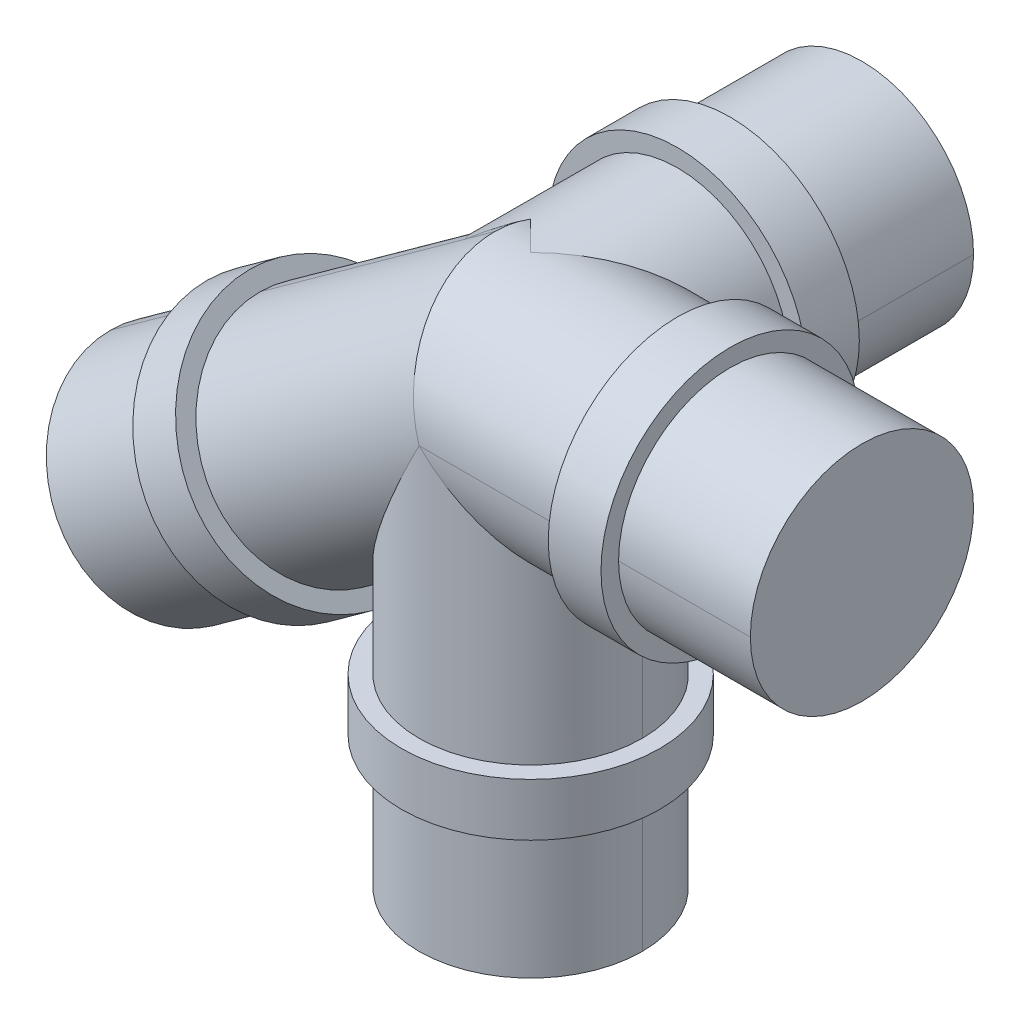
ISO-10303-21;
HEADER;
FILE_DESCRIPTION(('STEP AP214'),'2;1');
FILE_NAME('part.step','',(''),(''),'','','');
FILE_SCHEMA(('AUTOMOTIVE_DESIGN { 1 0 10303 214 1 1 1 1 }'));
ENDSEC;
DATA;
#1=APPLICATION_CONTEXT('core data for automotive mechanical design processes');
#2=APPLICATION_PROTOCOL_DEFINITION('international standard','automotive_design',2000,#1);
#3=PRODUCT_CONTEXT('',#1,'mechanical');
#4=PRODUCT('Part','Part','',(#3));
#5=PRODUCT_RELATED_PRODUCT_CATEGORY('part','',(#4));
#6=PRODUCT_DEFINITION_FORMATION('','',#4);
#7=PRODUCT_DEFINITION_CONTEXT('part definition',#1,'design');
#8=PRODUCT_DEFINITION('design','',#6,#7);
#9=PRODUCT_DEFINITION_SHAPE('','',#8);
#10=(LENGTH_UNIT() NAMED_UNIT(*) SI_UNIT(.MILLI.,.METRE.));
#11=(NAMED_UNIT(*) PLANE_ANGLE_UNIT() SI_UNIT($,.RADIAN.));
#12=(NAMED_UNIT(*) SI_UNIT($,.STERADIAN.) SOLID_ANGLE_UNIT());
#13=UNCERTAINTY_MEASURE_WITH_UNIT(LENGTH_MEASURE(1.E-05),#10,'distance_accuracy_value','');
#14=(GEOMETRIC_REPRESENTATION_CONTEXT(3) GLOBAL_UNCERTAINTY_ASSIGNED_CONTEXT((#13)) GLOBAL_UNIT_ASSIGNED_CONTEXT((#10,
#11,#12)) REPRESENTATION_CONTEXT('',''));
#15=CARTESIAN_POINT('',(0.,0.,0.));
#16=DIRECTION('',(0.,0.,1.));
#17=DIRECTION('',(1.,0.,0.));
#18=AXIS2_PLACEMENT_3D('',#15,#16,#17);
#19=CARTESIAN_POINT('',(699.112393095024,3041.53288183794,4064.45483546757));
#20=DIRECTION('',(0.,-1.,0.));
#21=DIRECTION('',(1.,0.,0.));
#22=AXIS2_PLACEMENT_3D('',#19,#20,#21);
#23=CYLINDRICAL_SURFACE('',#22,12.7);
#24=DIRECTION('',(0.,-1.,0.));
#25=VECTOR('',#24,1.);
#26=CARTESIAN_POINT('',(686.412393095024,3041.53288183794,4064.45483546757));
#27=LINE('',#26,#25);
#28=CARTESIAN_POINT('',(686.412393095024,3016.69478394616,4064.45483546757));
#29=VERTEX_POINT('',#28);
#30=CARTESIAN_POINT('',(686.412393095024,3012.69478394616,4064.45483546757));
#31=VERTEX_POINT('',#30);
#32=EDGE_CURVE('E176',#29,#31,#27,.T.);
#33=ORIENTED_EDGE('',*,*,#32,.T.);
#34=CARTESIAN_POINT('',(699.112393095024,3012.69478394616,4064.45483546757));
#35=DIRECTION('',(0.,-1.,0.));
#36=DIRECTION('',(0.,0.,-1.));
#37=AXIS2_PLACEMENT_3D('',#34,#35,#36);
#38=CIRCLE('',#37,12.6999999999993);
#39=CARTESIAN_POINT('',(711.812393095023,3012.69478394616,4064.45483546757));
#40=VERTEX_POINT('',#39);
#41=EDGE_CURVE('E60',#40,#31,#38,.T.);
#42=ORIENTED_EDGE('',*,*,#41,.F.);
#43=DIRECTION('',(0.,-1.,0.));
#44=VECTOR('',#43,1.);
#45=CARTESIAN_POINT('',(711.812393095024,3041.53288183794,4064.45483546757));
#46=LINE('',#45,#44);
#47=CARTESIAN_POINT('',(711.812393095024,3028.83288183794,4064.45483546757));
#48=VERTEX_POINT('',#47);
#49=EDGE_CURVE('E215',#48,#40,#46,.T.);
#50=ORIENTED_EDGE('',*,*,#49,.F.);
#51=CARTESIAN_POINT('',(699.112393095024,3041.53288183794,4077.15483546757));
#52=CARTESIAN_POINT('',(706.551880852886,3034.09339408007,4077.15483546757));
#53=CARTESIAN_POINT('',(711.812393095024,3028.83288183794,4071.89432322543));
#54=CARTESIAN_POINT('',(711.812393095024,3028.83288183794,4064.45483546757));
#55=(BOUNDED_CURVE() B_SPLINE_CURVE(3,(#51,#52,#53,#54),.UNSPECIFIED.,.F.,
.F.) B_SPLINE_CURVE_WITH_KNOTS((4,4),(4.7123889803847,6.28318530717958),
.UNSPECIFIED.) CURVE() GEOMETRIC_REPRESENTATION_ITEM() RATIONAL_B_SPLINE_CURVE((1.,
0.804737854124367,0.804737854124367,1.)) REPRESENTATION_ITEM(''));
#56=CARTESIAN_POINT('',(699.112393095024,3041.53288183794,4077.15483546757));
#57=VERTEX_POINT('',#56);
#58=EDGE_CURVE('E271',#57,#48,#55,.T.);
#59=ORIENTED_EDGE('',*,*,#58,.F.);
#60=CARTESIAN_POINT('',(686.412393095024,3016.69478394616,4064.45483546757));
#61=CARTESIAN_POINT('',(686.412393095024,3016.69478394616,4071.89432322543));
#62=CARTESIAN_POINT('',(691.672905337162,3026.98306095649,4077.15483546757));
#63=CARTESIAN_POINT('',(699.112393095024,3041.53288183794,4077.15483546757));
#64=(BOUNDED_CURVE() B_SPLINE_CURVE(3,(#60,#61,#62,#63),.UNSPECIFIED.,.F.,
.F.) B_SPLINE_CURVE_WITH_KNOTS((4,4),(3.14159265358979,4.71238898038468),
.UNSPECIFIED.) CURVE() GEOMETRIC_REPRESENTATION_ITEM() RATIONAL_B_SPLINE_CURVE((1.,
0.804737854124366,0.804737854124366,1.)) REPRESENTATION_ITEM(''));
#65=EDGE_CURVE('E224',#29,#57,#64,.T.);
#66=ORIENTED_EDGE('',*,*,#65,.F.);
#67=EDGE_LOOP('',(#33,#42,#50,#59,#66));
#68=FACE_BOUND('',#67,.T.);
#69=ADVANCED_FACE('F39',(#68),#23,.T.);
#70=CARTESIAN_POINT('',(699.112393095024,3041.53288183794,4064.45483546757));
#71=DIRECTION('',(0.,-1.,0.));
#72=DIRECTION('',(1.,0.,0.));
#73=AXIS2_PLACEMENT_3D('',#70,#71,#72);
#74=CYLINDRICAL_SURFACE('',#73,12.7);
#75=ORIENTED_EDGE('',*,*,#49,.T.);
#76=CARTESIAN_POINT('',(699.112393095024,3012.69478394616,4064.45483546757));
#77=DIRECTION('',(0.,-1.,0.));
#78=DIRECTION('',(0.,0.,-1.));
#79=AXIS2_PLACEMENT_3D('',#76,#77,#78);
#80=CIRCLE('',#79,12.7);
#81=EDGE_CURVE('E11',#40,#31,#80,.F.);
#82=ORIENTED_EDGE('',*,*,#81,.T.);
#83=ORIENTED_EDGE('',*,*,#32,.F.);
#84=CARTESIAN_POINT('',(693.330687958543,3030.22527883311,4053.14723246274));
#85=CARTESIAN_POINT('',(688.969024045552,3021.69492960147,4055.37740048673));
#86=CARTESIAN_POINT('',(686.412393095024,3016.69478394616,4059.55608445276));
#87=CARTESIAN_POINT('',(686.412393095024,3016.69478394616,4064.45483546757));
#88=(BOUNDED_CURVE() B_SPLINE_CURVE(3,(#84,#85,#86,#87),.UNSPECIFIED.,.F.,
.F.) B_SPLINE_CURVE_WITH_KNOTS((4,4),(2.04345197007274,3.14159265358979),
.UNSPECIFIED.) CURVE() GEOMETRIC_REPRESENTATION_ITEM() RATIONAL_B_SPLINE_CURVE((1.,
0.902006716050874,0.902006716050874,1.)) REPRESENTATION_ITEM(''));
#89=CARTESIAN_POINT('',(693.330687958543,3030.22527883311,4053.14723246274));
#90=VERTEX_POINT('',#89);
#91=EDGE_CURVE('E219',#90,#29,#88,.T.);
#92=ORIENTED_EDGE('',*,*,#91,.F.);
#93=CARTESIAN_POINT('',(708.092649216093,3032.55262571687,4055.4745793465));
#94=CARTESIAN_POINT('',(704.055047548784,3028.51502404956,4051.43697767919));
#95=CARTESIAN_POINT('',(698.414685133015,3027.62577365372,4050.54772728335));
#96=CARTESIAN_POINT('',(693.330687958543,3030.22527883311,4053.14723246274));
#97=(BOUNDED_CURVE() B_SPLINE_CURVE(3,(#93,#94,#95,#96),.UNSPECIFIED.,.F.,
.F.) B_SPLINE_CURVE_WITH_KNOTS((4,4),(2.35619449019236,3.61424829686762),
.UNSPECIFIED.) CURVE() GEOMETRIC_REPRESENTATION_ITEM() RATIONAL_B_SPLINE_CURVE((1.,
0.872400280301182,0.872400280301182,1.)) REPRESENTATION_ITEM(''));
#98=CARTESIAN_POINT('',(708.092649216093,3032.55262571687,4055.4745793465));
#99=VERTEX_POINT('',#98);
#100=EDGE_CURVE('E270',#99,#90,#97,.T.);
#101=ORIENTED_EDGE('',*,*,#100,.F.);
#102=CARTESIAN_POINT('',(711.812393095024,3028.83288183794,4064.45483546757));
#103=CARTESIAN_POINT('',(711.812393095024,3028.83288183794,4061.04156947135));
#104=CARTESIAN_POINT('',(710.506192748015,3030.13908218495,4057.88812287842));
#105=CARTESIAN_POINT('',(708.092649216093,3032.55262571687,4055.4745793465));
#106=(BOUNDED_CURVE() B_SPLINE_CURVE(3,(#102,#103,#104,#105),.UNSPECIFIED.,.F.,
.F.) B_SPLINE_CURVE_WITH_KNOTS((4,4),(0.,0.785398163397456),
.UNSPECIFIED.) CURVE() GEOMETRIC_REPRESENTATION_ITEM() RATIONAL_B_SPLINE_CURVE((1.,
0.949253021674189,0.949253021674189,1.)) REPRESENTATION_ITEM(''));
#107=EDGE_CURVE('E318',#48,#99,#106,.T.);
#108=ORIENTED_EDGE('',*,*,#107,.F.);
#109=EDGE_LOOP('',(#75,#82,#83,#92,#101,#108));
#110=FACE_BOUND('',#109,.T.);
#111=ADVANCED_FACE('F428',(#110),#74,.T.);
#112=CARTESIAN_POINT('',(87.4499312465951,2599.77665939185,4064.45483546757));
#113=DIRECTION('',(0.81067922839988,0.585490553844359,0.));
#114=DIRECTION('',(-0.585490553844359,0.81067922839988,0.));
#115=AXIS2_PLACEMENT_3D('',#112,#113,#114);
#116=CYLINDRICAL_SURFACE('',#115,12.7);
#117=DIRECTION('',(0.810679228399881,0.585490553844358,0.));
#118=VECTOR('',#117,1.);
#119=CARTESIAN_POINT('',(80.0142012127719,2610.07228559253,4064.45483546757));
#120=LINE('',#119,#118);
#121=CARTESIAN_POINT('',(668.298216113776,3034.94407413214,4064.45483546757));
#122=VERTEX_POINT('',#121);
#123=CARTESIAN_POINT('',(691.676663061201,3051.82850803862,4064.45483546757));
#124=VERTEX_POINT('',#123);
#125=EDGE_CURVE('E223',#122,#124,#120,.T.);
#126=ORIENTED_EDGE('',*,*,#125,.F.);
#127=CARTESIAN_POINT('',(675.7339461476,3024.64844793146,4064.45483546757));
#128=DIRECTION('',(-0.810679228399883,-0.585490553844356,0.));
#129=DIRECTION('',(0.585490553844356,-0.810679228399883,0.));
#130=AXIS2_PLACEMENT_3D('',#127,#128,#129);
#131=CIRCLE('',#130,12.6999999999995);
#132=CARTESIAN_POINT('',(683.169676181423,3014.35282173078,4064.45483546757));
#133=VERTEX_POINT('',#132);
#134=EDGE_CURVE('E398',#133,#122,#131,.T.);
#135=ORIENTED_EDGE('',*,*,#134,.F.);
#136=DIRECTION('',(0.810679228399881,0.585490553844358,0.));
#137=VECTOR('',#136,1.);
#138=CARTESIAN_POINT('',(94.885661280418,2589.48103319117,4064.45483546757));
#139=LINE('',#138,#137);
#140=EDGE_CURVE('E230',#133,#29,#139,.T.);
#141=ORIENTED_EDGE('',*,*,#140,.T.);
#142=ORIENTED_EDGE('',*,*,#65,.T.);
#143=CARTESIAN_POINT('',(699.112393095024,3041.53288183794,4077.15483546757));
#144=CARTESIAN_POINT('',(696.706804220225,3048.9723695958,4077.15483546757));
#145=CARTESIAN_POINT('',(695.005796014107,3054.23288183794,4071.89432322543));
#146=CARTESIAN_POINT('',(695.005796014108,3054.23288183794,4064.45483546757));
#147=(BOUNDED_CURVE() B_SPLINE_CURVE(3,(#143,#144,#145,#146),.UNSPECIFIED.,.F.,
.F.) B_SPLINE_CURVE_WITH_KNOTS((4,4),(4.71238898038467,6.28318530717959),
.UNSPECIFIED.) CURVE() GEOMETRIC_REPRESENTATION_ITEM() RATIONAL_B_SPLINE_CURVE((1.,
0.804737854124361,0.804737854124361,1.)) REPRESENTATION_ITEM(''));
#148=CARTESIAN_POINT('',(695.005796014108,3054.23288183794,4064.45483546757));
#149=VERTEX_POINT('',#148);
#150=EDGE_CURVE('E231',#57,#149,#147,.T.);
#151=ORIENTED_EDGE('',*,*,#150,.T.);
#152=DIRECTION('',(0.810679228399881,0.585490553844358,0.));
#153=VECTOR('',#152,1.);
#154=CARTESIAN_POINT('',(80.0142012127719,2610.07228559253,4064.45483546757));
#155=LINE('',#154,#153);
#156=EDGE_CURVE('E257',#124,#149,#155,.T.);
#157=ORIENTED_EDGE('',*,*,#156,.F.);
#158=EDGE_LOOP('',(#126,#135,#141,#142,#151,#157));
#159=FACE_BOUND('',#158,.T.);
#160=ADVANCED_FACE('F435',(#159),#116,.T.);
#161=CARTESIAN_POINT('',(87.4499312465951,2599.77665939185,4064.45483546757));
#162=DIRECTION('',(0.81067922839988,0.585490553844359,0.));
#163=DIRECTION('',(-0.585490553844359,0.81067922839988,0.));
#164=AXIS2_PLACEMENT_3D('',#161,#162,#163);
#165=CYLINDRICAL_SURFACE('',#164,12.7);
#166=ORIENTED_EDGE('',*,*,#140,.F.);
#167=CARTESIAN_POINT('',(675.733946147598,3024.64844793146,4064.45483546757));
#168=DIRECTION('',(-0.810679228399883,-0.585490553844356,0.));
#169=DIRECTION('',(0.585490553844356,-0.810679228399883,0.));
#170=AXIS2_PLACEMENT_3D('',#167,#168,#169);
#171=CIRCLE('',#170,12.7);
#172=EDGE_CURVE('E187',#133,#122,#171,.F.);
#173=ORIENTED_EDGE('',*,*,#172,.T.);
#174=ORIENTED_EDGE('',*,*,#125,.T.);
#175=CARTESIAN_POINT('',(686.412393095024,3041.53288183794,4054.15920926689));
#176=CARTESIAN_POINT('',(686.412393095024,3045.69129763272,4056.59392243369));
#177=CARTESIAN_POINT('',(688.305521753318,3049.39379487181,4060.29641967278));
#178=CARTESIAN_POINT('',(691.676663061201,3051.82850803862,4064.45483546757));
#179=(BOUNDED_CURVE() B_SPLINE_CURVE(3,(#175,#176,#177,#178),.UNSPECIFIED.,.F.,
.F.) B_SPLINE_CURVE_WITH_KNOTS((4,4),(3.76707769382902,4.7123889803847),
.UNSPECIFIED.) CURVE() GEOMETRIC_REPRESENTATION_ITEM() RATIONAL_B_SPLINE_CURVE((1.,
0.926908294216652,0.926908294216652,1.)) REPRESENTATION_ITEM(''));
#180=CARTESIAN_POINT('',(686.412393095024,3041.53288183794,4054.15920926689));
#181=VERTEX_POINT('',#180);
#182=EDGE_CURVE('E240',#181,#124,#179,.T.);
#183=ORIENTED_EDGE('',*,*,#182,.F.);
#184=CARTESIAN_POINT('',(693.330687958543,3030.22527883311,4053.14723246274));
#185=CARTESIAN_POINT('',(688.969024045551,3032.4554468571,4050.91706443875));
#186=CARTESIAN_POINT('',(686.412393095024,3036.63413082313,4051.29103682208));
#187=CARTESIAN_POINT('',(686.412393095024,3041.53288183794,4054.15920926689));
#188=(BOUNDED_CURVE() B_SPLINE_CURVE(3,(#184,#185,#186,#187),.UNSPECIFIED.,.F.,
.F.) B_SPLINE_CURVE_WITH_KNOTS((4,4),(2.66893701031195,3.76707769382902),
.UNSPECIFIED.) CURVE() GEOMETRIC_REPRESENTATION_ITEM() RATIONAL_B_SPLINE_CURVE((1.,
0.902006716050869,0.902006716050869,1.)) REPRESENTATION_ITEM(''));
#189=EDGE_CURVE('E264',#90,#181,#188,.T.);
#190=ORIENTED_EDGE('',*,*,#189,.F.);
#191=ORIENTED_EDGE('',*,*,#91,.T.);
#192=EDGE_LOOP('',(#166,#173,#174,#183,#190,#191));
#193=FACE_BOUND('',#192,.T.);
#194=ADVANCED_FACE('F489',(#193),#165,.T.);
#195=CARTESIAN_POINT('',(699.112393095024,3041.53288183794,3664.45483546757));
#196=DIRECTION('',(0.,0.,1.));
#197=DIRECTION('',(1.,0.,0.));
#198=AXIS2_PLACEMENT_3D('',#195,#196,#197);
#199=CYLINDRICAL_SURFACE('',#198,12.7);
#200=DIRECTION('',(0.,0.,1.));
#201=VECTOR('',#200,1.);
#202=CARTESIAN_POINT('',(711.812393095024,3041.53288183794,3664.45483546757));
#203=LINE('',#202,#201);
#204=CARTESIAN_POINT('',(711.812393095024,3041.53288183794,4047.75483546757));
#205=VERTEX_POINT('',#204);
#206=CARTESIAN_POINT('',(711.812393095024,3041.53288183794,4051.75483546757));
#207=VERTEX_POINT('',#206);
#208=EDGE_CURVE('E278',#205,#207,#203,.T.);
#209=ORIENTED_EDGE('',*,*,#208,.F.);
#210=CARTESIAN_POINT('',(699.112393095024,3041.53288183794,4047.75483546757));
#211=DIRECTION('',(0.,0.,-1.));
#212=DIRECTION('',(-1.,0.,0.));
#213=AXIS2_PLACEMENT_3D('',#210,#211,#212);
#214=CIRCLE('',#213,12.6999999999996);
#215=CARTESIAN_POINT('',(686.412393095024,3041.53288183794,4047.75483546757));
#216=VERTEX_POINT('',#215);
#217=EDGE_CURVE('E387',#216,#205,#214,.T.);
#218=ORIENTED_EDGE('',*,*,#217,.F.);
#219=DIRECTION('',(0.,0.,1.));
#220=VECTOR('',#219,1.);
#221=CARTESIAN_POINT('',(686.412393095024,3041.53288183794,3664.45483546757));
#222=LINE('',#221,#220);
#223=EDGE_CURVE('E251',#216,#181,#222,.T.);
#224=ORIENTED_EDGE('',*,*,#223,.T.);
#225=ORIENTED_EDGE('',*,*,#182,.T.);
#226=CARTESIAN_POINT('',(691.676663061201,3051.82850803862,4064.45483546757));
#227=CARTESIAN_POINT('',(692.75435374724,3052.60684020075,4063.12546788507));
#228=CARTESIAN_POINT('',(693.940108812374,3053.2078419436,4061.81232004051));
#229=CARTESIAN_POINT('',(695.204993240173,3053.61684751044,4060.54743561272));
#230=(BOUNDED_CURVE() B_SPLINE_CURVE(3,(#226,#227,#228,#229),.UNSPECIFIED.,.F.,
.F.) B_SPLINE_CURVE_WITH_KNOTS((4,4),(4.71238898038469,5.02513150050431),
.UNSPECIFIED.) CURVE() GEOMETRIC_REPRESENTATION_ITEM() RATIONAL_B_SPLINE_CURVE((1.,
0.9918659377805,0.9918659377805,1.)) REPRESENTATION_ITEM(''));
#231=CARTESIAN_POINT('',(695.204993240173,3053.61684751044,4060.54743561272));
#232=VERTEX_POINT('',#231);
#233=EDGE_CURVE('E232',#124,#232,#230,.T.);
#234=ORIENTED_EDGE('',*,*,#233,.T.);
#235=CARTESIAN_POINT('',(695.204993240173,3053.61684751044,4060.54743561272));
#236=CARTESIAN_POINT('',(696.469877667972,3054.02585307729,4061.81232004051));
#237=CARTESIAN_POINT('',(697.783025512526,3054.23288183794,4063.12546788507));
#238=CARTESIAN_POINT('',(699.112393095024,3054.23288183794,4064.45483546757));
#239=(BOUNDED_CURVE() B_SPLINE_CURVE(3,(#235,#236,#237,#238),.UNSPECIFIED.,.F.,
.F.) B_SPLINE_CURVE_WITH_KNOTS((4,4),(4.39964646026506,4.71238898038469),
.UNSPECIFIED.) CURVE() GEOMETRIC_REPRESENTATION_ITEM() RATIONAL_B_SPLINE_CURVE((1.,
0.991865937780499,0.991865937780499,1.)) REPRESENTATION_ITEM(''));
#240=CARTESIAN_POINT('',(699.112393095024,3054.23288183794,4064.45483546757));
#241=VERTEX_POINT('',#240);
#242=EDGE_CURVE('E241',#232,#241,#239,.T.);
#243=ORIENTED_EDGE('',*,*,#242,.T.);
#244=CARTESIAN_POINT('',(699.112393095024,3054.23288183794,4064.45483546757));
#245=CARTESIAN_POINT('',(706.551880852886,3054.23288183794,4057.01534770971));
#246=CARTESIAN_POINT('',(711.812393095024,3048.9723695958,4051.75483546757));
#247=CARTESIAN_POINT('',(711.812393095024,3041.53288183794,4051.75483546757));
#248=(BOUNDED_CURVE() B_SPLINE_CURVE(3,(#244,#245,#246,#247),.UNSPECIFIED.,.F.,
.F.) B_SPLINE_CURVE_WITH_KNOTS((4,4),(4.71238898038469,6.28318530717959),
.UNSPECIFIED.) CURVE() GEOMETRIC_REPRESENTATION_ITEM() RATIONAL_B_SPLINE_CURVE((1.,
0.804737854124364,0.804737854124364,1.)) REPRESENTATION_ITEM(''));
#249=EDGE_CURVE('E277',#241,#207,#248,.T.);
#250=ORIENTED_EDGE('',*,*,#249,.T.);
#251=EDGE_LOOP('',(#209,#218,#224,#225,#234,#243,#250));
#252=FACE_BOUND('',#251,.T.);
#253=ADVANCED_FACE('F455',(#252),#199,.T.);
#254=CARTESIAN_POINT('',(699.112393095024,3041.53288183794,3664.45483546757));
#255=DIRECTION('',(0.,0.,1.));
#256=DIRECTION('',(1.,0.,0.));
#257=AXIS2_PLACEMENT_3D('',#254,#255,#256);
#258=CYLINDRICAL_SURFACE('',#257,12.7);
#259=ORIENTED_EDGE('',*,*,#223,.F.);
#260=CARTESIAN_POINT('',(699.112393095024,3041.53288183794,4047.75483546757));
#261=DIRECTION('',(0.,0.,-1.));
#262=DIRECTION('',(-1.,0.,0.));
#263=AXIS2_PLACEMENT_3D('',#260,#261,#262);
#264=CIRCLE('',#263,12.7);
#265=EDGE_CURVE('E194',#216,#205,#264,.F.);
#266=ORIENTED_EDGE('',*,*,#265,.T.);
#267=ORIENTED_EDGE('',*,*,#208,.T.);
#268=CARTESIAN_POINT('',(711.812393095024,3041.53288183794,4051.75483546757));
#269=CARTESIAN_POINT('',(711.812393095024,3038.11961584172,4051.75483546757));
#270=CARTESIAN_POINT('',(710.506192748015,3034.96616924879,4053.06103581458));
#271=CARTESIAN_POINT('',(708.092649216093,3032.55262571687,4055.4745793465));
#272=(BOUNDED_CURVE() B_SPLINE_CURVE(3,(#268,#269,#270,#271),.UNSPECIFIED.,.F.,
.F.) B_SPLINE_CURVE_WITH_KNOTS((4,4),(0.,0.785398163397458),
.UNSPECIFIED.) CURVE() GEOMETRIC_REPRESENTATION_ITEM() RATIONAL_B_SPLINE_CURVE((1.,
0.94925302167419,0.94925302167419,1.)) REPRESENTATION_ITEM(''));
#273=EDGE_CURVE('E309',#207,#99,#272,.T.);
#274=ORIENTED_EDGE('',*,*,#273,.T.);
#275=ORIENTED_EDGE('',*,*,#100,.T.);
#276=ORIENTED_EDGE('',*,*,#189,.T.);
#277=EDGE_LOOP('',(#259,#266,#267,#274,#275,#276));
#278=FACE_BOUND('',#277,.T.);
#279=ADVANCED_FACE('F459',(#278),#258,.T.);
#280=CARTESIAN_POINT('',(689.977879517008,3041.53288183794,4064.45483546757));
#281=DIRECTION('',(1.,0.,0.));
#282=DIRECTION('',(0.,0.,-1.));
#283=AXIS2_PLACEMENT_3D('',#280,#281,#282);
#284=CYLINDRICAL_SURFACE('',#283,12.7);
#285=DIRECTION('',(1.,0.,0.));
#286=VECTOR('',#285,1.);
#287=CARTESIAN_POINT('',(689.977879517008,3041.53288183794,4077.15483546757));
#288=LINE('',#287,#286);
#289=CARTESIAN_POINT('',(715.812393095024,3041.53288183794,4077.15483546757));
#290=VERTEX_POINT('',#289);
#291=EDGE_CURVE('E284',#57,#290,#288,.T.);
#292=ORIENTED_EDGE('',*,*,#291,.T.);
#293=CARTESIAN_POINT('',(715.812393095024,3041.53288183794,4064.45483546757));
#294=DIRECTION('',(1.,0.,0.));
#295=DIRECTION('',(0.,0.,-1.));
#296=AXIS2_PLACEMENT_3D('',#293,#294,#295);
#297=CIRCLE('',#296,12.6999999999995);
#298=CARTESIAN_POINT('',(715.812393095024,3041.53288183794,4051.75483546757));
#299=VERTEX_POINT('',#298);
#300=EDGE_CURVE('E376',#299,#290,#297,.T.);
#301=ORIENTED_EDGE('',*,*,#300,.F.);
#302=DIRECTION('',(1.,0.,0.));
#303=VECTOR('',#302,1.);
#304=CARTESIAN_POINT('',(689.977879517008,3041.53288183794,4051.75483546757));
#305=LINE('',#304,#303);
#306=EDGE_CURVE('E327',#207,#299,#305,.T.);
#307=ORIENTED_EDGE('',*,*,#306,.F.);
#308=ORIENTED_EDGE('',*,*,#249,.F.);
#309=ORIENTED_EDGE('',*,*,#242,.F.);
#310=CARTESIAN_POINT('',(695.005796014108,3054.23288183794,4064.45483546757));
#311=CARTESIAN_POINT('',(695.005796014107,3054.23288183794,4063.12546788507));
#312=CARTESIAN_POINT('',(695.07273961286,3054.02585307729,4061.81232004051));
#313=CARTESIAN_POINT('',(695.204993240173,3053.61684751044,4060.54743561272));
#314=(BOUNDED_CURVE() B_SPLINE_CURVE(3,(#310,#311,#312,#313),.UNSPECIFIED.,.F.,
.F.) B_SPLINE_CURVE_WITH_KNOTS((4,4),(0.,0.312742520119622),
.UNSPECIFIED.) CURVE() GEOMETRIC_REPRESENTATION_ITEM() RATIONAL_B_SPLINE_CURVE((1.,
0.9918659377805,0.9918659377805,1.)) REPRESENTATION_ITEM(''));
#315=EDGE_CURVE('E263',#149,#232,#314,.T.);
#316=ORIENTED_EDGE('',*,*,#315,.F.);
#317=ORIENTED_EDGE('',*,*,#150,.F.);
#318=EDGE_LOOP('',(#292,#301,#307,#308,#309,#316,#317));
#319=FACE_BOUND('',#318,.T.);
#320=ADVANCED_FACE('F472',(#319),#284,.T.);
#321=CARTESIAN_POINT('',(689.977879517008,3041.53288183794,4064.45483546757));
#322=DIRECTION('',(1.,0.,0.));
#323=DIRECTION('',(0.,0.,-1.));
#324=AXIS2_PLACEMENT_3D('',#321,#322,#323);
#325=CYLINDRICAL_SURFACE('',#324,12.7);
#326=ORIENTED_EDGE('',*,*,#306,.T.);
#327=CARTESIAN_POINT('',(715.812393095024,3041.53288183794,4064.45483546757));
#328=DIRECTION('',(1.,0.,0.));
#329=DIRECTION('',(0.,0.,-1.));
#330=AXIS2_PLACEMENT_3D('',#327,#328,#329);
#331=CIRCLE('',#330,12.7);
#332=EDGE_CURVE('E200',#299,#290,#331,.F.);
#333=ORIENTED_EDGE('',*,*,#332,.T.);
#334=ORIENTED_EDGE('',*,*,#291,.F.);
#335=ORIENTED_EDGE('',*,*,#58,.T.);
#336=ORIENTED_EDGE('',*,*,#107,.T.);
#337=ORIENTED_EDGE('',*,*,#273,.F.);
#338=EDGE_LOOP('',(#326,#333,#334,#335,#336,#337));
#339=FACE_BOUND('',#338,.T.);
#340=ADVANCED_FACE('F463',(#339),#325,.T.);
#341=CARTESIAN_POINT('',(87.4499312465951,2599.77665939185,4064.45483546757));
#342=DIRECTION('',(0.81067922839988,0.585490553844359,0.));
#343=DIRECTION('',(-0.585490553844359,0.81067922839988,0.));
#344=AXIS2_PLACEMENT_3D('',#341,#342,#343);
#345=CYLINDRICAL_SURFACE('',#344,12.7);
#346=ORIENTED_EDGE('',*,*,#233,.F.);
#347=ORIENTED_EDGE('',*,*,#156,.T.);
#348=ORIENTED_EDGE('',*,*,#315,.T.);
#349=EDGE_LOOP('',(#346,#347,#348));
#350=FACE_BOUND('',#349,.T.);
#351=ADVANCED_FACE('F460',(#350),#345,.T.);
#352=CARTESIAN_POINT('',(715.812393095024,3041.53288183794,4064.45483546757));
#353=DIRECTION('',(1.,0.,0.));
#354=DIRECTION('',(0.,0.,-1.));
#355=AXIS2_PLACEMENT_3D('',#352,#353,#354);
#356=CYLINDRICAL_SURFACE('',#355,14.6999999999996);
#357=CARTESIAN_POINT('',(715.812393095024,3041.53288183794,4064.45483546757));
#358=DIRECTION('',(1.,0.,0.));
#359=DIRECTION('',(0.,0.,-1.));
#360=AXIS2_PLACEMENT_3D('',#357,#358,#359);
#361=CIRCLE('',#360,14.6999999999996);
#362=CARTESIAN_POINT('',(715.812393095024,3041.53288183794,4049.75483546757));
#363=VERTEX_POINT('',#362);
#364=EDGE_CURVE('E372',#363,#363,#361,.T.);
#365=ORIENTED_EDGE('',*,*,#364,.T.);
#366=EDGE_LOOP('',(#365));
#367=FACE_BOUND('',#366,.T.);
#368=CARTESIAN_POINT('',(721.812393095024,3041.53288183794,4064.45483546757));
#369=DIRECTION('',(1.,0.,0.));
#370=DIRECTION('',(0.,0.,-1.));
#371=AXIS2_PLACEMENT_3D('',#368,#369,#370);
#372=CIRCLE('',#371,14.6999999999996);
#373=CARTESIAN_POINT('',(721.812393095024,3041.53288183794,4049.75483546757));
#374=VERTEX_POINT('',#373);
#375=EDGE_CURVE('E373',#374,#374,#372,.T.);
#376=ORIENTED_EDGE('',*,*,#375,.F.);
#377=EDGE_LOOP('',(#376));
#378=FACE_BOUND('',#377,.T.);
#379=ADVANCED_FACE('F462',(#367,#378),#356,.T.);
#380=CARTESIAN_POINT('',(715.812393095024,3041.53288183794,4064.45483546757));
#381=DIRECTION('',(1.,0.,0.));
#382=DIRECTION('',(0.,0.,-1.));
#383=AXIS2_PLACEMENT_3D('',#380,#381,#382);
#384=PLANE('',#383);
#385=ORIENTED_EDGE('',*,*,#300,.T.);
#386=ORIENTED_EDGE('',*,*,#332,.F.);
#387=EDGE_LOOP('',(#385,#386));
#388=FACE_BOUND('',#387,.T.);
#389=ORIENTED_EDGE('',*,*,#364,.F.);
#390=EDGE_LOOP('',(#389));
#391=FACE_BOUND('',#390,.T.);
#392=ADVANCED_FACE('F469',(#388,#391),#384,.F.);
#393=CARTESIAN_POINT('',(721.812393095024,3041.53288183794,4064.45483546757));
#394=DIRECTION('',(1.,0.,0.));
#395=DIRECTION('',(0.,0.,-1.));
#396=AXIS2_PLACEMENT_3D('',#393,#394,#395);
#397=PLANE('',#396);
#398=CARTESIAN_POINT('',(721.812393095024,3041.53288183794,4064.45483546757));
#399=DIRECTION('',(1.,0.,0.));
#400=DIRECTION('',(0.,0.,-1.));
#401=AXIS2_PLACEMENT_3D('',#398,#399,#400);
#402=CIRCLE('',#401,12.6999999999995);
#403=CARTESIAN_POINT('',(721.812393095024,3041.53288183794,4051.75483546757));
#404=VERTEX_POINT('',#403);
#405=CARTESIAN_POINT('',(721.812393095024,3041.53288183794,4077.15483546757));
#406=VERTEX_POINT('',#405);
#407=EDGE_CURVE('E379',#404,#406,#402,.T.);
#408=ORIENTED_EDGE('',*,*,#407,.F.);
#409=CARTESIAN_POINT('',(721.812393095024,3041.53288183794,4064.45483546757));
#410=DIRECTION('',(1.,0.,0.));
#411=DIRECTION('',(0.,0.,-1.));
#412=AXIS2_PLACEMENT_3D('',#409,#410,#411);
#413=CIRCLE('',#412,12.7);
#414=EDGE_CURVE('E203',#404,#406,#413,.F.);
#415=ORIENTED_EDGE('',*,*,#414,.T.);
#416=EDGE_LOOP('',(#408,#415));
#417=FACE_BOUND('',#416,.T.);
#418=ORIENTED_EDGE('',*,*,#375,.T.);
#419=EDGE_LOOP('',(#418));
#420=FACE_BOUND('',#419,.T.);
#421=ADVANCED_FACE('F503',(#417,#420),#397,.T.);
#422=CARTESIAN_POINT('',(736.812393095024,3056.77783126833,4077.79892104388));
#423=DIRECTION('',(-1.,0.,0.));
#424=DIRECTION('',(0.,0.,1.));
#425=AXIS2_PLACEMENT_3D('',#422,#423,#424);
#426=PLANE('',#425);
#427=CARTESIAN_POINT('',(736.812393095024,3041.53288183794,4064.45483546757));
#428=DIRECTION('',(-1.,0.,0.));
#429=DIRECTION('',(0.,0.,1.));
#430=AXIS2_PLACEMENT_3D('',#427,#428,#429);
#431=CIRCLE('',#430,12.7);
#432=CARTESIAN_POINT('',(736.812393095024,3041.53288183794,4051.75483546757));
#433=VERTEX_POINT('',#432);
#434=CARTESIAN_POINT('',(736.812393095024,3041.53288183794,4077.15483546757));
#435=VERTEX_POINT('',#434);
#436=EDGE_CURVE('E365',#433,#435,#431,.F.);
#437=ORIENTED_EDGE('',*,*,#436,.T.);
#438=CARTESIAN_POINT('',(736.812393095024,3041.53288183794,4064.45483546757));
#439=DIRECTION('',(-1.,0.,0.));
#440=DIRECTION('',(0.,0.,1.));
#441=AXIS2_PLACEMENT_3D('',#438,#439,#440);
#442=CIRCLE('',#441,12.7);
#443=EDGE_CURVE('E206',#435,#433,#442,.F.);
#444=ORIENTED_EDGE('',*,*,#443,.T.);
#445=EDGE_LOOP('',(#437,#444));
#446=FACE_BOUND('',#445,.T.);
#447=ADVANCED_FACE('F510',(#446),#426,.F.);
#448=ORIENTED_EDGE('',*,*,#414,.F.);
#449=EDGE_CURVE('E222',#404,#433,#305,.T.);
#450=ORIENTED_EDGE('',*,*,#449,.T.);
#451=ORIENTED_EDGE('',*,*,#443,.F.);
#452=EDGE_CURVE('E250',#406,#435,#288,.T.);
#453=ORIENTED_EDGE('',*,*,#452,.F.);
#454=EDGE_LOOP('',(#448,#450,#451,#453));
#455=FACE_BOUND('',#454,.T.);
#456=ADVANCED_FACE('F41',(#455),#325,.T.);
#457=ORIENTED_EDGE('',*,*,#407,.T.);
#458=ORIENTED_EDGE('',*,*,#452,.T.);
#459=ORIENTED_EDGE('',*,*,#436,.F.);
#460=ORIENTED_EDGE('',*,*,#449,.F.);
#461=EDGE_LOOP('',(#457,#458,#459,#460));
#462=FACE_BOUND('',#461,.T.);
#463=ADVANCED_FACE('F534',(#462),#284,.T.);
#464=CARTESIAN_POINT('',(699.112393095024,3041.53288183794,4047.75483546757));
#465=DIRECTION('',(0.,0.,-1.));
#466=DIRECTION('',(-1.,0.,0.));
#467=AXIS2_PLACEMENT_3D('',#464,#465,#466);
#468=CYLINDRICAL_SURFACE('',#467,14.6999999999997);
#469=CARTESIAN_POINT('',(699.112393095024,3041.53288183794,4047.75483546757));
#470=DIRECTION('',(0.,0.,-1.));
#471=DIRECTION('',(-1.,0.,0.));
#472=AXIS2_PLACEMENT_3D('',#469,#470,#471);
#473=CIRCLE('',#472,14.6999999999997);
#474=CARTESIAN_POINT('',(684.412393095024,3041.53288183794,4047.75483546757));
#475=VERTEX_POINT('',#474);
#476=EDGE_CURVE('E382',#475,#475,#473,.T.);
#477=ORIENTED_EDGE('',*,*,#476,.T.);
#478=EDGE_LOOP('',(#477));
#479=FACE_BOUND('',#478,.T.);
#480=CARTESIAN_POINT('',(699.112393095024,3041.53288183794,4041.75483546757));
#481=DIRECTION('',(0.,0.,-1.));
#482=DIRECTION('',(-1.,0.,0.));
#483=AXIS2_PLACEMENT_3D('',#480,#481,#482);
#484=CIRCLE('',#483,14.6999999999997);
#485=CARTESIAN_POINT('',(684.412393095024,3041.53288183794,4041.75483546757));
#486=VERTEX_POINT('',#485);
#487=EDGE_CURVE('E384',#486,#486,#484,.T.);
#488=ORIENTED_EDGE('',*,*,#487,.F.);
#489=EDGE_LOOP('',(#488));
#490=FACE_BOUND('',#489,.T.);
#491=ADVANCED_FACE('F536',(#479,#490),#468,.T.);
#492=CARTESIAN_POINT('',(699.112393095024,3041.53288183794,4047.75483546757));
#493=DIRECTION('',(0.,0.,-1.));
#494=DIRECTION('',(-1.,0.,0.));
#495=AXIS2_PLACEMENT_3D('',#492,#493,#494);
#496=PLANE('',#495);
#497=ORIENTED_EDGE('',*,*,#217,.T.);
#498=ORIENTED_EDGE('',*,*,#265,.F.);
#499=EDGE_LOOP('',(#497,#498));
#500=FACE_BOUND('',#499,.T.);
#501=ORIENTED_EDGE('',*,*,#476,.F.);
#502=EDGE_LOOP('',(#501));
#503=FACE_BOUND('',#502,.T.);
#504=ADVANCED_FACE('F589',(#500,#503),#496,.F.);
#505=CARTESIAN_POINT('',(699.112393095024,3041.53288183794,4041.75483546757));
#506=DIRECTION('',(0.,0.,-1.));
#507=DIRECTION('',(-1.,0.,0.));
#508=AXIS2_PLACEMENT_3D('',#505,#506,#507);
#509=PLANE('',#508);
#510=CARTESIAN_POINT('',(699.112393095024,3041.53288183794,4041.75483546757));
#511=DIRECTION('',(0.,0.,-1.));
#512=DIRECTION('',(-1.,0.,0.));
#513=AXIS2_PLACEMENT_3D('',#510,#511,#512);
#514=CIRCLE('',#513,12.6999999999996);
#515=CARTESIAN_POINT('',(686.412393095024,3041.53288183794,4041.75483546757));
#516=VERTEX_POINT('',#515);
#517=CARTESIAN_POINT('',(711.812393095024,3041.53288183794,4041.75483546757));
#518=VERTEX_POINT('',#517);
#519=EDGE_CURVE('E390',#516,#518,#514,.T.);
#520=ORIENTED_EDGE('',*,*,#519,.F.);
#521=CARTESIAN_POINT('',(699.112393095024,3041.53288183794,4041.75483546757));
#522=DIRECTION('',(0.,0.,-1.));
#523=DIRECTION('',(-1.,0.,0.));
#524=AXIS2_PLACEMENT_3D('',#521,#522,#523);
#525=CIRCLE('',#524,12.7);
#526=EDGE_CURVE('E197',#516,#518,#525,.F.);
#527=ORIENTED_EDGE('',*,*,#526,.T.);
#528=EDGE_LOOP('',(#520,#527));
#529=FACE_BOUND('',#528,.T.);
#530=ORIENTED_EDGE('',*,*,#487,.T.);
#531=EDGE_LOOP('',(#530));
#532=FACE_BOUND('',#531,.T.);
#533=ADVANCED_FACE('F529',(#529,#532),#509,.T.);
#534=CARTESIAN_POINT('',(0.,2941.53288183794,4026.75483546757));
#535=DIRECTION('',(0.,0.,-1.));
#536=DIRECTION('',(-1.,0.,0.));
#537=AXIS2_PLACEMENT_3D('',#534,#535,#536);
#538=PLANE('',#537);
#539=CARTESIAN_POINT('',(699.112393095024,3041.53288183794,4026.75483546757));
#540=DIRECTION('',(0.,0.,-1.));
#541=DIRECTION('',(-1.,0.,0.));
#542=AXIS2_PLACEMENT_3D('',#539,#540,#541);
#543=CIRCLE('',#542,12.7);
#544=CARTESIAN_POINT('',(711.812393095024,3041.53288183794,4026.75483546757));
#545=VERTEX_POINT('',#544);
#546=CARTESIAN_POINT('',(686.412393095024,3041.53288183794,4026.75483546757));
#547=VERTEX_POINT('',#546);
#548=EDGE_CURVE('E360',#545,#547,#543,.F.);
#549=ORIENTED_EDGE('',*,*,#548,.F.);
#550=CARTESIAN_POINT('',(699.112393095024,3041.53288183794,4026.75483546757));
#551=DIRECTION('',(0.,0.,-1.));
#552=DIRECTION('',(-1.,0.,0.));
#553=AXIS2_PLACEMENT_3D('',#550,#551,#552);
#554=CIRCLE('',#553,12.7);
#555=EDGE_CURVE('E212',#547,#545,#554,.F.);
#556=ORIENTED_EDGE('',*,*,#555,.F.);
#557=EDGE_LOOP('',(#549,#556));
#558=FACE_BOUND('',#557,.T.);
#559=ADVANCED_FACE('F457',(#558),#538,.T.);
#560=ORIENTED_EDGE('',*,*,#526,.F.);
#561=EDGE_CURVE('E247',#547,#516,#222,.T.);
#562=ORIENTED_EDGE('',*,*,#561,.F.);
#563=ORIENTED_EDGE('',*,*,#555,.T.);
#564=EDGE_CURVE('E272',#545,#518,#203,.T.);
#565=ORIENTED_EDGE('',*,*,#564,.T.);
#566=EDGE_LOOP('',(#560,#562,#563,#565));
#567=FACE_BOUND('',#566,.T.);
#568=ADVANCED_FACE('F453',(#567),#258,.T.);
#569=ORIENTED_EDGE('',*,*,#519,.T.);
#570=ORIENTED_EDGE('',*,*,#564,.F.);
#571=ORIENTED_EDGE('',*,*,#548,.T.);
#572=ORIENTED_EDGE('',*,*,#561,.T.);
#573=EDGE_LOOP('',(#569,#570,#571,#572));
#574=FACE_BOUND('',#573,.T.);
#575=ADVANCED_FACE('F449',(#574),#199,.T.);
#576=CARTESIAN_POINT('',(675.7339461476,3024.64844793146,4064.45483546757));
#577=DIRECTION('',(-0.810679228399883,-0.585490553844356,0.));
#578=DIRECTION('',(0.585490553844356,-0.810679228399883,0.));
#579=AXIS2_PLACEMENT_3D('',#576,#577,#578);
#580=CYLINDRICAL_SURFACE('',#579,14.6999999999996);
#581=CARTESIAN_POINT('',(675.7339461476,3024.64844793146,4064.45483546757));
#582=DIRECTION('',(-0.810679228399883,-0.585490553844356,0.));
#583=DIRECTION('',(0.585490553844356,-0.810679228399883,0.));
#584=AXIS2_PLACEMENT_3D('',#581,#582,#583);
#585=CIRCLE('',#584,14.6999999999996);
#586=CARTESIAN_POINT('',(684.340657289112,3012.73146327398,4064.45483546757));
#587=VERTEX_POINT('',#586);
#588=EDGE_CURVE('E393',#587,#587,#585,.T.);
#589=ORIENTED_EDGE('',*,*,#588,.T.);
#590=EDGE_LOOP('',(#589));
#591=FACE_BOUND('',#590,.T.);
#592=CARTESIAN_POINT('',(670.869870777201,3021.1355046084,4064.45483546757));
#593=DIRECTION('',(-0.810679228399883,-0.585490553844356,0.));
#594=DIRECTION('',(0.585490553844356,-0.810679228399883,0.));
#595=AXIS2_PLACEMENT_3D('',#592,#593,#594);
#596=CIRCLE('',#595,14.6999999999996);
#597=CARTESIAN_POINT('',(679.476581918712,3009.21851995092,4064.45483546757));
#598=VERTEX_POINT('',#597);
#599=EDGE_CURVE('E395',#598,#598,#596,.T.);
#600=ORIENTED_EDGE('',*,*,#599,.F.);
#601=EDGE_LOOP('',(#600));
#602=FACE_BOUND('',#601,.T.);
#603=ADVANCED_FACE('F452',(#591,#602),#580,.T.);
#604=CARTESIAN_POINT('',(675.7339461476,3024.64844793146,4064.45483546757));
#605=DIRECTION('',(-0.810679228399883,-0.585490553844356,0.));
#606=DIRECTION('',(0.585490553844356,-0.810679228399883,0.));
#607=AXIS2_PLACEMENT_3D('',#604,#605,#606);
#608=PLANE('',#607);
#609=ORIENTED_EDGE('',*,*,#134,.T.);
#610=ORIENTED_EDGE('',*,*,#172,.F.);
#611=EDGE_LOOP('',(#609,#610));
#612=FACE_BOUND('',#611,.T.);
#613=ORIENTED_EDGE('',*,*,#588,.F.);
#614=EDGE_LOOP('',(#613));
#615=FACE_BOUND('',#614,.T.);
#616=ADVANCED_FACE('F639',(#612,#615),#608,.F.);
#617=CARTESIAN_POINT('',(670.869870777201,3021.1355046084,4064.45483546757));
#618=DIRECTION('',(-0.810679228399883,-0.585490553844356,0.));
#619=DIRECTION('',(0.585490553844356,-0.810679228399883,0.));
#620=AXIS2_PLACEMENT_3D('',#617,#618,#619);
#621=PLANE('',#620);
#622=CARTESIAN_POINT('',(670.869870777201,3021.1355046084,4064.45483546757));
#623=DIRECTION('',(-0.810679228399883,-0.585490553844356,0.));
#624=DIRECTION('',(0.585490553844356,-0.810679228399883,0.));
#625=AXIS2_PLACEMENT_3D('',#622,#623,#624);
#626=CIRCLE('',#625,12.6999999999995);
#627=CARTESIAN_POINT('',(678.305600811023,3010.83987840772,4064.45483546757));
#628=VERTEX_POINT('',#627);
#629=CARTESIAN_POINT('',(663.434140743378,3031.43113080907,4064.45483546757));
#630=VERTEX_POINT('',#629);
#631=EDGE_CURVE('E401',#628,#630,#626,.T.);
#632=ORIENTED_EDGE('',*,*,#631,.F.);
#633=CARTESIAN_POINT('',(670.869870777199,3021.1355046084,4064.45483546757));
#634=DIRECTION('',(-0.810679228399883,-0.585490553844356,0.));
#635=DIRECTION('',(0.585490553844356,-0.810679228399883,0.));
#636=AXIS2_PLACEMENT_3D('',#633,#634,#635);
#637=CIRCLE('',#636,12.7);
#638=EDGE_CURVE('E189',#628,#630,#637,.F.);
#639=ORIENTED_EDGE('',*,*,#638,.T.);
#640=EDGE_LOOP('',(#632,#639));
#641=FACE_BOUND('',#640,.T.);
#642=ORIENTED_EDGE('',*,*,#599,.T.);
#643=EDGE_LOOP('',(#642));
#644=FACE_BOUND('',#643,.T.);
#645=ADVANCED_FACE('F525',(#641,#644),#621,.T.);
#646=CARTESIAN_POINT('',(673.629610718392,2991.69478394616,4077.79892104388));
#647=DIRECTION('',(0.810679228399884,0.585490553844354,0.));
#648=DIRECTION('',(-0.585490553844354,0.810679228399884,0.));
#649=AXIS2_PLACEMENT_3D('',#646,#647,#648);
#650=PLANE('',#649);
#651=CARTESIAN_POINT('',(658.709682351203,3012.35314630073,4064.45483546757));
#652=DIRECTION('',(0.810679228399884,0.585490553844354,0.));
#653=DIRECTION('',(-0.585490553844354,0.810679228399884,0.));
#654=AXIS2_PLACEMENT_3D('',#651,#652,#653);
#655=CIRCLE('',#654,12.7);
#656=CARTESIAN_POINT('',(666.145412385027,3002.05752010005,4064.45483546757));
#657=VERTEX_POINT('',#656);
#658=CARTESIAN_POINT('',(651.27395231738,3022.64877250141,4064.45483546757));
#659=VERTEX_POINT('',#658);
#660=EDGE_CURVE('E368',#657,#659,#655,.F.);
#661=ORIENTED_EDGE('',*,*,#660,.T.);
#662=CARTESIAN_POINT('',(658.709682351203,3012.35314630073,4064.45483546757));
#663=DIRECTION('',(0.810679228399884,0.585490553844354,0.));
#664=DIRECTION('',(-0.585490553844354,0.810679228399884,0.));
#665=AXIS2_PLACEMENT_3D('',#662,#663,#664);
#666=CIRCLE('',#665,12.7);
#667=EDGE_CURVE('E209',#659,#657,#666,.F.);
#668=ORIENTED_EDGE('',*,*,#667,.T.);
#669=EDGE_LOOP('',(#661,#668));
#670=FACE_BOUND('',#669,.T.);
#671=ADVANCED_FACE('F521',(#670),#650,.F.);
#672=ORIENTED_EDGE('',*,*,#638,.F.);
#673=EDGE_CURVE('E177',#657,#628,#139,.T.);
#674=ORIENTED_EDGE('',*,*,#673,.F.);
#675=ORIENTED_EDGE('',*,*,#667,.F.);
#676=EDGE_CURVE('E220',#659,#630,#120,.T.);
#677=ORIENTED_EDGE('',*,*,#676,.T.);
#678=EDGE_LOOP('',(#672,#674,#675,#677));
#679=FACE_BOUND('',#678,.T.);
#680=ADVANCED_FACE('F524',(#679),#165,.T.);
#681=ORIENTED_EDGE('',*,*,#631,.T.);
#682=ORIENTED_EDGE('',*,*,#676,.F.);
#683=ORIENTED_EDGE('',*,*,#660,.F.);
#684=ORIENTED_EDGE('',*,*,#673,.T.);
#685=EDGE_LOOP('',(#681,#682,#683,#684));
#686=FACE_BOUND('',#685,.T.);
#687=ADVANCED_FACE('F425',(#686),#116,.T.);
#688=CARTESIAN_POINT('',(699.112393095024,3012.69478394616,4064.45483546757));
#689=DIRECTION('',(0.,-1.,0.));
#690=DIRECTION('',(0.,0.,-1.));
#691=AXIS2_PLACEMENT_3D('',#688,#689,#690);
#692=CYLINDRICAL_SURFACE('',#691,14.6999999999997);
#693=CARTESIAN_POINT('',(699.112393095024,3012.69478394616,4064.45483546757));
#694=DIRECTION('',(0.,-1.,0.));
#695=DIRECTION('',(0.,0.,-1.));
#696=AXIS2_PLACEMENT_3D('',#693,#694,#695);
#697=CIRCLE('',#696,14.6999999999997);
#698=CARTESIAN_POINT('',(699.112393095024,3012.69478394616,4049.75483546757));
#699=VERTEX_POINT('',#698);
#700=EDGE_CURVE('E404',#699,#699,#697,.T.);
#701=ORIENTED_EDGE('',*,*,#700,.T.);
#702=EDGE_LOOP('',(#701));
#703=FACE_BOUND('',#702,.T.);
#704=CARTESIAN_POINT('',(699.112393095024,3006.69478394616,4064.45483546757));
#705=DIRECTION('',(0.,-1.,0.));
#706=DIRECTION('',(0.,0.,-1.));
#707=AXIS2_PLACEMENT_3D('',#704,#705,#706);
#708=CIRCLE('',#707,14.6999999999997);
#709=CARTESIAN_POINT('',(699.112393095024,3006.69478394616,4049.75483546757));
#710=VERTEX_POINT('',#709);
#711=EDGE_CURVE('E406',#710,#710,#708,.T.);
#712=ORIENTED_EDGE('',*,*,#711,.F.);
#713=EDGE_LOOP('',(#712));
#714=FACE_BOUND('',#713,.T.);
#715=ADVANCED_FACE('F413',(#703,#714),#692,.T.);
#716=CARTESIAN_POINT('',(699.112393095024,3012.69478394616,4064.45483546757));
#717=DIRECTION('',(0.,-1.,0.));
#718=DIRECTION('',(0.,0.,-1.));
#719=AXIS2_PLACEMENT_3D('',#716,#717,#718);
#720=PLANE('',#719);
#721=ORIENTED_EDGE('',*,*,#41,.T.);
#722=ORIENTED_EDGE('',*,*,#81,.F.);
#723=EDGE_LOOP('',(#721,#722));
#724=FACE_BOUND('',#723,.T.);
#725=ORIENTED_EDGE('',*,*,#700,.F.);
#726=EDGE_LOOP('',(#725));
#727=FACE_BOUND('',#726,.T.);
#728=ADVANCED_FACE('F416',(#724,#727),#720,.F.);
#729=CARTESIAN_POINT('',(699.112393095024,3006.69478394616,4064.45483546757));
#730=DIRECTION('',(0.,-1.,0.));
#731=DIRECTION('',(0.,0.,-1.));
#732=AXIS2_PLACEMENT_3D('',#729,#730,#731);
#733=PLANE('',#732);
#734=CARTESIAN_POINT('',(699.112393095024,3006.69478394616,4064.45483546757));
#735=DIRECTION('',(0.,-1.,0.));
#736=DIRECTION('',(0.,0.,-1.));
#737=AXIS2_PLACEMENT_3D('',#734,#735,#736);
#738=CIRCLE('',#737,12.6999999999993);
#739=CARTESIAN_POINT('',(711.812393095024,3006.69478394616,4064.45483546757));
#740=VERTEX_POINT('',#739);
#741=CARTESIAN_POINT('',(686.412393095025,3006.69478394616,4064.45483546757));
#742=VERTEX_POINT('',#741);
#743=EDGE_CURVE('E180',#740,#742,#738,.T.);
#744=ORIENTED_EDGE('',*,*,#743,.F.);
#745=CARTESIAN_POINT('',(699.112393095024,3006.69478394616,4064.45483546757));
#746=DIRECTION('',(0.,-1.,0.));
#747=DIRECTION('',(0.,0.,-1.));
#748=AXIS2_PLACEMENT_3D('',#745,#746,#747);
#749=CIRCLE('',#748,12.7);
#750=EDGE_CURVE('E47',#740,#742,#749,.F.);
#751=ORIENTED_EDGE('',*,*,#750,.T.);
#752=EDGE_LOOP('',(#744,#751));
#753=FACE_BOUND('',#752,.T.);
#754=ORIENTED_EDGE('',*,*,#711,.T.);
#755=EDGE_LOOP('',(#754));
#756=FACE_BOUND('',#755,.T.);
#757=ADVANCED_FACE('F185',(#753,#756),#733,.T.);
#758=CARTESIAN_POINT('',(736.812393095024,2991.69478394616,4077.79892104388));
#759=DIRECTION('',(0.,1.,0.));
#760=DIRECTION('',(0.,0.,1.));
#761=AXIS2_PLACEMENT_3D('',#758,#759,#760);
#762=PLANE('',#761);
#763=CARTESIAN_POINT('',(699.112393095024,2991.69478394616,4064.45483546757));
#764=DIRECTION('',(0.,1.,0.));
#765=DIRECTION('',(0.,0.,1.));
#766=AXIS2_PLACEMENT_3D('',#763,#764,#765);
#767=CIRCLE('',#766,12.7);
#768=CARTESIAN_POINT('',(711.812393095024,2991.69478394616,4064.45483546757));
#769=VERTEX_POINT('',#768);
#770=CARTESIAN_POINT('',(686.412393095024,2991.69478394616,4064.45483546757));
#771=VERTEX_POINT('',#770);
#772=EDGE_CURVE('E370',#769,#771,#767,.F.);
#773=ORIENTED_EDGE('',*,*,#772,.T.);
#774=CARTESIAN_POINT('',(699.112393095024,2991.69478394616,4064.45483546757));
#775=DIRECTION('',(0.,1.,0.));
#776=DIRECTION('',(0.,0.,1.));
#777=AXIS2_PLACEMENT_3D('',#774,#775,#776);
#778=CIRCLE('',#777,12.7);
#779=EDGE_CURVE('E172',#771,#769,#778,.F.);
#780=ORIENTED_EDGE('',*,*,#779,.T.);
#781=EDGE_LOOP('',(#773,#780));
#782=FACE_BOUND('',#781,.T.);
#783=ADVANCED_FACE('F423',(#782),#762,.F.);
#784=ORIENTED_EDGE('',*,*,#750,.F.);
#785=EDGE_CURVE('E182',#740,#769,#46,.T.);
#786=ORIENTED_EDGE('',*,*,#785,.T.);
#787=ORIENTED_EDGE('',*,*,#779,.F.);
#788=EDGE_CURVE('E168',#742,#771,#27,.T.);
#789=ORIENTED_EDGE('',*,*,#788,.F.);
#790=EDGE_LOOP('',(#784,#786,#787,#789));
#791=FACE_BOUND('',#790,.T.);
#792=ADVANCED_FACE('F170',(#791),#74,.T.);
#793=ORIENTED_EDGE('',*,*,#743,.T.);
#794=ORIENTED_EDGE('',*,*,#788,.T.);
#795=ORIENTED_EDGE('',*,*,#772,.F.);
#796=ORIENTED_EDGE('',*,*,#785,.F.);
#797=EDGE_LOOP('',(#793,#794,#795,#796));
#798=FACE_BOUND('',#797,.T.);
#799=ADVANCED_FACE('F181',(#798),#23,.T.);
#800=CLOSED_SHELL('',(#69,#111,#160,#194,#253,#279,#320,#340,#351,#379,#392,#421,#447,#456,#463,
#491,#504,#533,#559,#568,#575,#603,#616,#645,#671,#680,#687,#715,#728,#757,#783,#792,#799));
#801=MANIFOLD_SOLID_BREP('B2',#800);
#802=ADVANCED_BREP_SHAPE_REPRESENTATION('',(#18,#801),#14);
#803=SHAPE_DEFINITION_REPRESENTATION(#9,#802);
ENDSEC;
END-ISO-10303-21;
